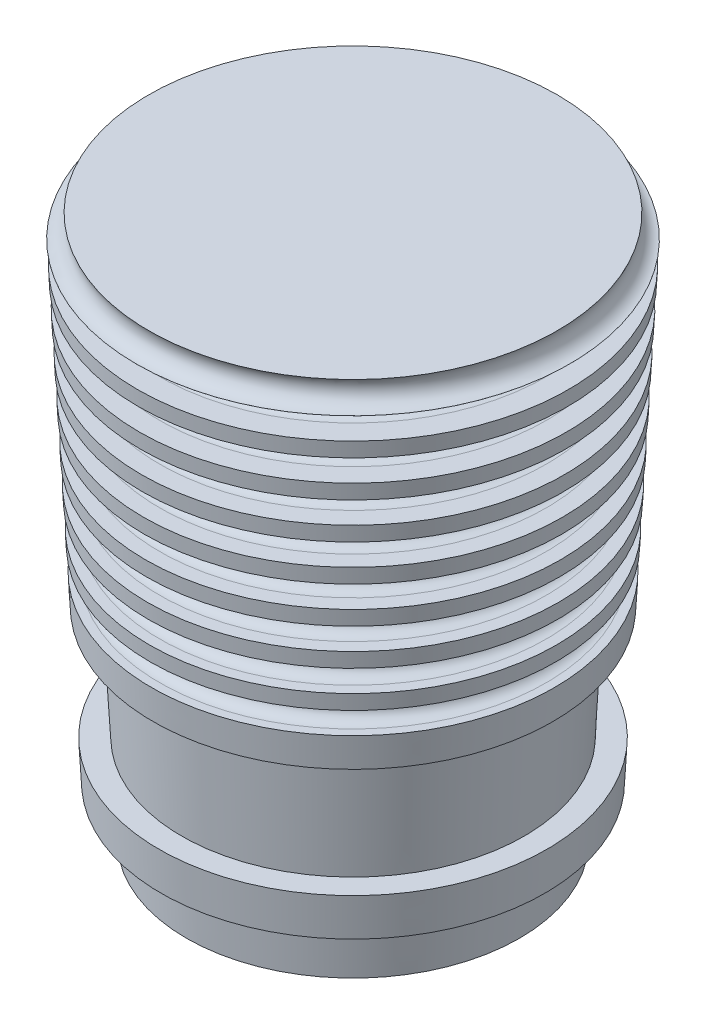
ISO-10303-21;
HEADER;
FILE_DESCRIPTION(('STEP AP214'),'2;1');
FILE_NAME('part.step','',(''),(''),'','','');
FILE_SCHEMA(('AUTOMOTIVE_DESIGN { 1 0 10303 214 1 1 1 1 }'));
ENDSEC;
DATA;
#1=APPLICATION_CONTEXT('core data for automotive mechanical design processes');
#2=APPLICATION_PROTOCOL_DEFINITION('international standard','automotive_design',2000,#1);
#3=PRODUCT_CONTEXT('',#1,'mechanical');
#4=PRODUCT('Part','Part','',(#3));
#5=PRODUCT_RELATED_PRODUCT_CATEGORY('part','',(#4));
#6=PRODUCT_DEFINITION_FORMATION('','',#4);
#7=PRODUCT_DEFINITION_CONTEXT('part definition',#1,'design');
#8=PRODUCT_DEFINITION('design','',#6,#7);
#9=PRODUCT_DEFINITION_SHAPE('','',#8);
#10=(LENGTH_UNIT() NAMED_UNIT(*) SI_UNIT(.MILLI.,.METRE.));
#11=(NAMED_UNIT(*) PLANE_ANGLE_UNIT() SI_UNIT($,.RADIAN.));
#12=(NAMED_UNIT(*) SI_UNIT($,.STERADIAN.) SOLID_ANGLE_UNIT());
#13=UNCERTAINTY_MEASURE_WITH_UNIT(LENGTH_MEASURE(1.E-05),#10,'distance_accuracy_value','');
#14=(GEOMETRIC_REPRESENTATION_CONTEXT(3) GLOBAL_UNCERTAINTY_ASSIGNED_CONTEXT((#13)) GLOBAL_UNIT_ASSIGNED_CONTEXT((#10,
#11,#12)) REPRESENTATION_CONTEXT('',''));
#15=CARTESIAN_POINT('',(0.,0.,0.));
#16=DIRECTION('',(0.,0.,1.));
#17=DIRECTION('',(1.,0.,0.));
#18=AXIS2_PLACEMENT_3D('',#15,#16,#17);
#19=CARTESIAN_POINT('',(0.,0.,0.));
#20=DIRECTION('',(0.,1.,0.));
#21=DIRECTION('',(0.,0.,1.));
#22=AXIS2_PLACEMENT_3D('',#19,#20,#21);
#23=CONICAL_SURFACE('',#22,25.,0.05235987755983);
#24=CARTESIAN_POINT('',(0.,59.,0.));
#25=DIRECTION('',(0.,1.,0.));
#26=DIRECTION('',(0.,0.,1.));
#27=AXIS2_PLACEMENT_3D('',#24,#25,#26);
#28=CIRCLE('',#27,28.0920589776994);
#29=CARTESIAN_POINT('',(0.,59.,28.0920589776994));
#30=VERTEX_POINT('',#29);
#31=EDGE_CURVE('E89',#30,#30,#28,.T.);
#32=ORIENTED_EDGE('',*,*,#31,.T.);
#33=EDGE_LOOP('',(#32));
#34=FACE_BOUND('',#33,.T.);
#35=CARTESIAN_POINT('',(0.,61.,0.));
#36=DIRECTION('',(0.,-1.,0.));
#37=DIRECTION('',(0.,0.,-1.));
#38=AXIS2_PLACEMENT_3D('',#35,#36,#37);
#39=CIRCLE('',#38,28.1968745362655);
#40=CARTESIAN_POINT('',(0.,61.,-28.1968745362655));
#41=VERTEX_POINT('',#40);
#42=EDGE_CURVE('E83',#41,#41,#39,.T.);
#43=ORIENTED_EDGE('',*,*,#42,.T.);
#44=EDGE_LOOP('',(#43));
#45=FACE_BOUND('',#44,.T.);
#46=ADVANCED_FACE('F43',(#34,#45),#23,.T.);
#47=CARTESIAN_POINT('',(0.,61.,-28.4589134326807));
#48=DIRECTION('',(0.,-1.,0.));
#49=DIRECTION('',(0.,0.,-1.));
#50=AXIS2_PLACEMENT_3D('',#47,#48,#49);
#51=PLANE('',#50);
#52=CARTESIAN_POINT('',(0.,61.,0.));
#53=DIRECTION('',(0.,-1.,0.));
#54=DIRECTION('',(0.,0.,-1.));
#55=AXIS2_PLACEMENT_3D('',#52,#53,#54);
#56=CIRCLE('',#55,25.5334080636115);
#57=CARTESIAN_POINT('',(0.,61.,-25.5334080636115));
#58=VERTEX_POINT('',#57);
#59=EDGE_CURVE('E84',#58,#58,#56,.T.);
#60=ORIENTED_EDGE('',*,*,#59,.T.);
#61=EDGE_LOOP('',(#60));
#62=FACE_BOUND('',#61,.T.);
#63=ORIENTED_EDGE('',*,*,#42,.F.);
#64=EDGE_LOOP('',(#63));
#65=FACE_BOUND('',#64,.T.);
#66=ADVANCED_FACE('F250',(#62,#65),#51,.F.);
#67=CARTESIAN_POINT('',(0.,64.,-25.5334080636115));
#68=DIRECTION('',(0.,1.,0.));
#69=DIRECTION('',(0.,0.,1.));
#70=AXIS2_PLACEMENT_3D('',#67,#68,#69);
#71=PLANE('',#70);
#72=CARTESIAN_POINT('',(0.,64.,0.));
#73=DIRECTION('',(0.,-1.,0.));
#74=DIRECTION('',(0.,0.,-1.));
#75=AXIS2_PLACEMENT_3D('',#72,#73,#74);
#76=CIRCLE('',#75,25.5334080636115);
#77=CARTESIAN_POINT('',(0.,64.,-25.5334080636115));
#78=VERTEX_POINT('',#77);
#79=EDGE_CURVE('E98',#78,#78,#76,.T.);
#80=ORIENTED_EDGE('',*,*,#79,.F.);
#81=EDGE_LOOP('',(#80));
#82=FACE_BOUND('',#81,.T.);
#83=CARTESIAN_POINT('',(0.,64.,0.));
#84=DIRECTION('',(0.,1.,0.));
#85=DIRECTION('',(0.,0.,1.));
#86=AXIS2_PLACEMENT_3D('',#83,#84,#85);
#87=CIRCLE('',#86,28.3540978741147);
#88=CARTESIAN_POINT('',(0.,64.,28.3540978741147));
#89=VERTEX_POINT('',#88);
#90=EDGE_CURVE('E79',#89,#89,#87,.T.);
#91=ORIENTED_EDGE('',*,*,#90,.F.);
#92=EDGE_LOOP('',(#91));
#93=FACE_BOUND('',#92,.T.);
#94=ADVANCED_FACE('F258',(#82,#93),#71,.F.);
#95=CARTESIAN_POINT('',(0.,62.5,0.));
#96=DIRECTION('',(0.,-1.,0.));
#97=DIRECTION('',(0.,0.,-1.));
#98=AXIS2_PLACEMENT_3D('',#95,#96,#97);
#99=TOROIDAL_SURFACE('',#98,25.5334080636115,1.49999999999999);
#100=ORIENTED_EDGE('',*,*,#59,.F.);
#101=EDGE_LOOP('',(#100));
#102=FACE_BOUND('',#101,.T.);
#103=ORIENTED_EDGE('',*,*,#79,.T.);
#104=EDGE_LOOP('',(#103));
#105=FACE_BOUND('',#104,.T.);
#106=ADVANCED_FACE('F357',(#102,#105),#99,.F.);
#107=CARTESIAN_POINT('',(0.,69.0027409305053,0.));
#108=DIRECTION('',(0.,1.,0.));
#109=DIRECTION('',(0.,0.,1.));
#110=AXIS2_PLACEMENT_3D('',#107,#108,#109);
#111=CIRCLE('',#110,28.6162804166108);
#112=CARTESIAN_POINT('',(0.,69.0027409305053,28.6162804166108));
#113=VERTEX_POINT('',#112);
#114=EDGE_CURVE('E47',#113,#113,#111,.F.);
#115=ORIENTED_EDGE('',*,*,#114,.T.);
#116=EDGE_LOOP('',(#115));
#117=FACE_BOUND('',#116,.T.);
#118=CARTESIAN_POINT('',(0.,69.,0.));
#119=DIRECTION('',(0.,-1.,0.));
#120=DIRECTION('',(0.,0.,-1.));
#121=AXIS2_PLACEMENT_3D('',#118,#119,#120);
#122=CIRCLE('',#121,28.6161367705298);
#123=CARTESIAN_POINT('',(0.,69.,-28.6161367705298));
#124=VERTEX_POINT('',#123);
#125=EDGE_CURVE('E193',#124,#124,#122,.T.);
#126=ORIENTED_EDGE('',*,*,#125,.F.);
#127=EDGE_LOOP('',(#126));
#128=FACE_BOUND('',#127,.T.);
#129=ADVANCED_FACE('F213',(#117,#128),#23,.T.);
#130=CARTESIAN_POINT('',(0.,69.,-25.5334080636115));
#131=DIRECTION('',(0.,1.,0.));
#132=DIRECTION('',(0.,0.,1.));
#133=AXIS2_PLACEMENT_3D('',#130,#131,#132);
#134=PLANE('',#133);
#135=CARTESIAN_POINT('',(0.,69.,0.));
#136=DIRECTION('',(0.,-1.,0.));
#137=DIRECTION('',(0.,0.,-1.));
#138=AXIS2_PLACEMENT_3D('',#135,#136,#137);
#139=CIRCLE('',#138,25.5334080636115);
#140=CARTESIAN_POINT('',(0.,69.,-25.5334080636115));
#141=VERTEX_POINT('',#140);
#142=EDGE_CURVE('E88',#141,#141,#139,.T.);
#143=ORIENTED_EDGE('',*,*,#142,.F.);
#144=EDGE_LOOP('',(#143));
#145=FACE_BOUND('',#144,.T.);
#146=ORIENTED_EDGE('',*,*,#125,.T.);
#147=EDGE_LOOP('',(#146));
#148=FACE_BOUND('',#147,.T.);
#149=ADVANCED_FACE('F363',(#145,#148),#134,.F.);
#150=CARTESIAN_POINT('',(0.,67.5,0.));
#151=DIRECTION('',(0.,-1.,0.));
#152=DIRECTION('',(0.,0.,-1.));
#153=AXIS2_PLACEMENT_3D('',#150,#151,#152);
#154=TOROIDAL_SURFACE('',#153,25.5334080636115,1.49999999999999);
#155=CARTESIAN_POINT('',(0.,66.,0.));
#156=DIRECTION('',(0.,-1.,0.));
#157=DIRECTION('',(0.,0.,-1.));
#158=AXIS2_PLACEMENT_3D('',#155,#156,#157);
#159=CIRCLE('',#158,25.5334080636115);
#160=CARTESIAN_POINT('',(0.,66.,-25.5334080636115));
#161=VERTEX_POINT('',#160);
#162=EDGE_CURVE('E67',#161,#161,#159,.T.);
#163=ORIENTED_EDGE('',*,*,#162,.F.);
#164=EDGE_LOOP('',(#163));
#165=FACE_BOUND('',#164,.T.);
#166=ORIENTED_EDGE('',*,*,#142,.T.);
#167=EDGE_LOOP('',(#166));
#168=FACE_BOUND('',#167,.T.);
#169=ADVANCED_FACE('F365',(#165,#168),#154,.F.);
#170=CARTESIAN_POINT('',(0.,66.,-28.4589134326807));
#171=DIRECTION('',(0.,-1.,0.));
#172=DIRECTION('',(0.,0.,-1.));
#173=AXIS2_PLACEMENT_3D('',#170,#171,#172);
#174=PLANE('',#173);
#175=CARTESIAN_POINT('',(0.,66.,0.));
#176=DIRECTION('',(0.,-1.,0.));
#177=DIRECTION('',(0.,0.,-1.));
#178=AXIS2_PLACEMENT_3D('',#175,#176,#177);
#179=CIRCLE('',#178,28.4589134326807);
#180=CARTESIAN_POINT('',(0.,66.,-28.4589134326807));
#181=VERTEX_POINT('',#180);
#182=EDGE_CURVE('E197',#181,#181,#179,.T.);
#183=ORIENTED_EDGE('',*,*,#182,.F.);
#184=EDGE_LOOP('',(#183));
#185=FACE_BOUND('',#184,.T.);
#186=ORIENTED_EDGE('',*,*,#162,.T.);
#187=EDGE_LOOP('',(#186));
#188=FACE_BOUND('',#187,.T.);
#189=ADVANCED_FACE('F264',(#185,#188),#174,.F.);
#190=ORIENTED_EDGE('',*,*,#90,.T.);
#191=EDGE_LOOP('',(#190));
#192=FACE_BOUND('',#191,.T.);
#193=ORIENTED_EDGE('',*,*,#182,.T.);
#194=EDGE_LOOP('',(#193));
#195=FACE_BOUND('',#194,.T.);
#196=ADVANCED_FACE('F252',(#192,#195),#23,.T.);
#197=CARTESIAN_POINT('',(0.,56.,-28.4589134326807));
#198=DIRECTION('',(0.,-1.,0.));
#199=DIRECTION('',(0.,0.,-1.));
#200=AXIS2_PLACEMENT_3D('',#197,#198,#199);
#201=PLANE('',#200);
#202=CARTESIAN_POINT('',(0.,56.,0.));
#203=DIRECTION('',(0.,-1.,0.));
#204=DIRECTION('',(0.,0.,-1.));
#205=AXIS2_PLACEMENT_3D('',#202,#203,#204);
#206=CIRCLE('',#205,25.5334080636115);
#207=CARTESIAN_POINT('',(0.,56.,-25.5334080636115));
#208=VERTEX_POINT('',#207);
#209=EDGE_CURVE('E94',#208,#208,#206,.T.);
#210=ORIENTED_EDGE('',*,*,#209,.T.);
#211=EDGE_LOOP('',(#210));
#212=FACE_BOUND('',#211,.T.);
#213=CARTESIAN_POINT('',(0.,56.,0.));
#214=DIRECTION('',(0.,-1.,0.));
#215=DIRECTION('',(0.,0.,-1.));
#216=AXIS2_PLACEMENT_3D('',#213,#214,#215);
#217=CIRCLE('',#216,27.9348356398503);
#218=CARTESIAN_POINT('',(0.,56.,-27.9348356398503));
#219=VERTEX_POINT('',#218);
#220=EDGE_CURVE('E93',#219,#219,#217,.T.);
#221=ORIENTED_EDGE('',*,*,#220,.F.);
#222=EDGE_LOOP('',(#221));
#223=FACE_BOUND('',#222,.T.);
#224=ADVANCED_FACE('F263',(#212,#223),#201,.F.);
#225=CARTESIAN_POINT('',(0.,59.,-25.5334080636115));
#226=DIRECTION('',(0.,1.,0.));
#227=DIRECTION('',(0.,0.,1.));
#228=AXIS2_PLACEMENT_3D('',#225,#226,#227);
#229=PLANE('',#228);
#230=CARTESIAN_POINT('',(0.,59.,0.));
#231=DIRECTION('',(0.,-1.,0.));
#232=DIRECTION('',(0.,0.,-1.));
#233=AXIS2_PLACEMENT_3D('',#230,#231,#232);
#234=CIRCLE('',#233,25.5334080636115);
#235=CARTESIAN_POINT('',(0.,59.,-25.5334080636115));
#236=VERTEX_POINT('',#235);
#237=EDGE_CURVE('E108',#236,#236,#234,.T.);
#238=ORIENTED_EDGE('',*,*,#237,.F.);
#239=EDGE_LOOP('',(#238));
#240=FACE_BOUND('',#239,.T.);
#241=ORIENTED_EDGE('',*,*,#31,.F.);
#242=EDGE_LOOP('',(#241));
#243=FACE_BOUND('',#242,.T.);
#244=ADVANCED_FACE('F278',(#240,#243),#229,.F.);
#245=CARTESIAN_POINT('',(0.,57.5,0.));
#246=DIRECTION('',(0.,-1.,0.));
#247=DIRECTION('',(0.,0.,-1.));
#248=AXIS2_PLACEMENT_3D('',#245,#246,#247);
#249=TOROIDAL_SURFACE('',#248,25.5334080636115,1.49999999999999);
#250=ORIENTED_EDGE('',*,*,#209,.F.);
#251=EDGE_LOOP('',(#250));
#252=FACE_BOUND('',#251,.T.);
#253=ORIENTED_EDGE('',*,*,#237,.T.);
#254=EDGE_LOOP('',(#253));
#255=FACE_BOUND('',#254,.T.);
#256=ADVANCED_FACE('F268',(#252,#255),#249,.F.);
#257=CARTESIAN_POINT('',(0.,54.,0.));
#258=DIRECTION('',(0.,1.,0.));
#259=DIRECTION('',(0.,0.,1.));
#260=AXIS2_PLACEMENT_3D('',#257,#258,#259);
#261=CIRCLE('',#260,27.8300200812842);
#262=CARTESIAN_POINT('',(0.,54.,27.8300200812842));
#263=VERTEX_POINT('',#262);
#264=EDGE_CURVE('E99',#263,#263,#261,.T.);
#265=ORIENTED_EDGE('',*,*,#264,.T.);
#266=EDGE_LOOP('',(#265));
#267=FACE_BOUND('',#266,.T.);
#268=ORIENTED_EDGE('',*,*,#220,.T.);
#269=EDGE_LOOP('',(#268));
#270=FACE_BOUND('',#269,.T.);
#271=ADVANCED_FACE('F253',(#267,#270),#23,.T.);
#272=CARTESIAN_POINT('',(0.,51.,-28.4589134326807));
#273=DIRECTION('',(0.,-1.,0.));
#274=DIRECTION('',(0.,0.,-1.));
#275=AXIS2_PLACEMENT_3D('',#272,#273,#274);
#276=PLANE('',#275);
#277=CARTESIAN_POINT('',(0.,51.,0.));
#278=DIRECTION('',(0.,-1.,0.));
#279=DIRECTION('',(0.,0.,-1.));
#280=AXIS2_PLACEMENT_3D('',#277,#278,#279);
#281=CIRCLE('',#280,25.5334080636115);
#282=CARTESIAN_POINT('',(0.,51.,-25.5334080636115));
#283=VERTEX_POINT('',#282);
#284=EDGE_CURVE('E104',#283,#283,#281,.T.);
#285=ORIENTED_EDGE('',*,*,#284,.T.);
#286=EDGE_LOOP('',(#285));
#287=FACE_BOUND('',#286,.T.);
#288=CARTESIAN_POINT('',(0.,51.,0.));
#289=DIRECTION('',(0.,-1.,0.));
#290=DIRECTION('',(0.,0.,-1.));
#291=AXIS2_PLACEMENT_3D('',#288,#289,#290);
#292=CIRCLE('',#291,27.6727967434351);
#293=CARTESIAN_POINT('',(0.,51.,-27.6727967434351));
#294=VERTEX_POINT('',#293);
#295=EDGE_CURVE('E103',#294,#294,#292,.T.);
#296=ORIENTED_EDGE('',*,*,#295,.F.);
#297=EDGE_LOOP('',(#296));
#298=FACE_BOUND('',#297,.T.);
#299=ADVANCED_FACE('F267',(#287,#298),#276,.F.);
#300=CARTESIAN_POINT('',(0.,54.,-25.5334080636115));
#301=DIRECTION('',(0.,1.,0.));
#302=DIRECTION('',(0.,0.,1.));
#303=AXIS2_PLACEMENT_3D('',#300,#301,#302);
#304=PLANE('',#303);
#305=CARTESIAN_POINT('',(0.,54.,0.));
#306=DIRECTION('',(0.,-1.,0.));
#307=DIRECTION('',(0.,0.,-1.));
#308=AXIS2_PLACEMENT_3D('',#305,#306,#307);
#309=CIRCLE('',#308,25.5334080636115);
#310=CARTESIAN_POINT('',(0.,54.,-25.5334080636115));
#311=VERTEX_POINT('',#310);
#312=EDGE_CURVE('E118',#311,#311,#309,.T.);
#313=ORIENTED_EDGE('',*,*,#312,.F.);
#314=EDGE_LOOP('',(#313));
#315=FACE_BOUND('',#314,.T.);
#316=ORIENTED_EDGE('',*,*,#264,.F.);
#317=EDGE_LOOP('',(#316));
#318=FACE_BOUND('',#317,.T.);
#319=ADVANCED_FACE('F275',(#315,#318),#304,.F.);
#320=CARTESIAN_POINT('',(0.,52.5,0.));
#321=DIRECTION('',(0.,-1.,0.));
#322=DIRECTION('',(0.,0.,-1.));
#323=AXIS2_PLACEMENT_3D('',#320,#321,#322);
#324=TOROIDAL_SURFACE('',#323,25.5334080636115,1.49999999999999);
#325=ORIENTED_EDGE('',*,*,#284,.F.);
#326=EDGE_LOOP('',(#325));
#327=FACE_BOUND('',#326,.T.);
#328=ORIENTED_EDGE('',*,*,#312,.T.);
#329=EDGE_LOOP('',(#328));
#330=FACE_BOUND('',#329,.T.);
#331=ADVANCED_FACE('F284',(#327,#330),#324,.F.);
#332=CARTESIAN_POINT('',(0.,49.,0.));
#333=DIRECTION('',(0.,1.,0.));
#334=DIRECTION('',(0.,0.,1.));
#335=AXIS2_PLACEMENT_3D('',#332,#333,#334);
#336=CIRCLE('',#335,27.567981184869);
#337=CARTESIAN_POINT('',(0.,49.,27.567981184869));
#338=VERTEX_POINT('',#337);
#339=EDGE_CURVE('E109',#338,#338,#336,.T.);
#340=ORIENTED_EDGE('',*,*,#339,.T.);
#341=EDGE_LOOP('',(#340));
#342=FACE_BOUND('',#341,.T.);
#343=ORIENTED_EDGE('',*,*,#295,.T.);
#344=EDGE_LOOP('',(#343));
#345=FACE_BOUND('',#344,.T.);
#346=ADVANCED_FACE('F270',(#342,#345),#23,.T.);
#347=CARTESIAN_POINT('',(0.,46.,-28.4589134326807));
#348=DIRECTION('',(0.,-1.,0.));
#349=DIRECTION('',(0.,0.,-1.));
#350=AXIS2_PLACEMENT_3D('',#347,#348,#349);
#351=PLANE('',#350);
#352=CARTESIAN_POINT('',(0.,46.,0.));
#353=DIRECTION('',(0.,-1.,0.));
#354=DIRECTION('',(0.,0.,-1.));
#355=AXIS2_PLACEMENT_3D('',#352,#353,#354);
#356=CIRCLE('',#355,25.5334080636115);
#357=CARTESIAN_POINT('',(0.,46.,-25.5334080636115));
#358=VERTEX_POINT('',#357);
#359=EDGE_CURVE('E114',#358,#358,#356,.T.);
#360=ORIENTED_EDGE('',*,*,#359,.T.);
#361=EDGE_LOOP('',(#360));
#362=FACE_BOUND('',#361,.T.);
#363=CARTESIAN_POINT('',(0.,46.,0.));
#364=DIRECTION('',(0.,-1.,0.));
#365=DIRECTION('',(0.,0.,-1.));
#366=AXIS2_PLACEMENT_3D('',#363,#364,#365);
#367=CIRCLE('',#366,27.4107578470199);
#368=CARTESIAN_POINT('',(0.,46.,-27.4107578470199));
#369=VERTEX_POINT('',#368);
#370=EDGE_CURVE('E113',#369,#369,#367,.T.);
#371=ORIENTED_EDGE('',*,*,#370,.F.);
#372=EDGE_LOOP('',(#371));
#373=FACE_BOUND('',#372,.T.);
#374=ADVANCED_FACE('F283',(#362,#373),#351,.F.);
#375=CARTESIAN_POINT('',(0.,49.,-25.5334080636115));
#376=DIRECTION('',(0.,1.,0.));
#377=DIRECTION('',(0.,0.,1.));
#378=AXIS2_PLACEMENT_3D('',#375,#376,#377);
#379=PLANE('',#378);
#380=CARTESIAN_POINT('',(0.,49.,0.));
#381=DIRECTION('',(0.,-1.,0.));
#382=DIRECTION('',(0.,0.,-1.));
#383=AXIS2_PLACEMENT_3D('',#380,#381,#382);
#384=CIRCLE('',#383,25.5334080636115);
#385=CARTESIAN_POINT('',(0.,49.,-25.5334080636115));
#386=VERTEX_POINT('',#385);
#387=EDGE_CURVE('E128',#386,#386,#384,.T.);
#388=ORIENTED_EDGE('',*,*,#387,.F.);
#389=EDGE_LOOP('',(#388));
#390=FACE_BOUND('',#389,.T.);
#391=ORIENTED_EDGE('',*,*,#339,.F.);
#392=EDGE_LOOP('',(#391));
#393=FACE_BOUND('',#392,.T.);
#394=ADVANCED_FACE('F291',(#390,#393),#379,.F.);
#395=CARTESIAN_POINT('',(0.,47.5,0.));
#396=DIRECTION('',(0.,-1.,0.));
#397=DIRECTION('',(0.,0.,-1.));
#398=AXIS2_PLACEMENT_3D('',#395,#396,#397);
#399=TOROIDAL_SURFACE('',#398,25.5334080636115,1.49999999999999);
#400=ORIENTED_EDGE('',*,*,#359,.F.);
#401=EDGE_LOOP('',(#400));
#402=FACE_BOUND('',#401,.T.);
#403=ORIENTED_EDGE('',*,*,#387,.T.);
#404=EDGE_LOOP('',(#403));
#405=FACE_BOUND('',#404,.T.);
#406=ADVANCED_FACE('F299',(#402,#405),#399,.F.);
#407=CARTESIAN_POINT('',(0.,44.,0.));
#408=DIRECTION('',(0.,1.,0.));
#409=DIRECTION('',(0.,0.,1.));
#410=AXIS2_PLACEMENT_3D('',#407,#408,#409);
#411=CIRCLE('',#410,27.3059422884538);
#412=CARTESIAN_POINT('',(0.,44.,27.3059422884538));
#413=VERTEX_POINT('',#412);
#414=EDGE_CURVE('E119',#413,#413,#411,.T.);
#415=ORIENTED_EDGE('',*,*,#414,.T.);
#416=EDGE_LOOP('',(#415));
#417=FACE_BOUND('',#416,.T.);
#418=ORIENTED_EDGE('',*,*,#370,.T.);
#419=EDGE_LOOP('',(#418));
#420=FACE_BOUND('',#419,.T.);
#421=ADVANCED_FACE('F286',(#417,#420),#23,.T.);
#422=CARTESIAN_POINT('',(0.,41.,-28.4589134326807));
#423=DIRECTION('',(0.,-1.,0.));
#424=DIRECTION('',(0.,0.,-1.));
#425=AXIS2_PLACEMENT_3D('',#422,#423,#424);
#426=PLANE('',#425);
#427=CARTESIAN_POINT('',(0.,41.,0.));
#428=DIRECTION('',(0.,-1.,0.));
#429=DIRECTION('',(0.,0.,-1.));
#430=AXIS2_PLACEMENT_3D('',#427,#428,#429);
#431=CIRCLE('',#430,25.5334080636115);
#432=CARTESIAN_POINT('',(0.,41.,-25.5334080636115));
#433=VERTEX_POINT('',#432);
#434=EDGE_CURVE('E124',#433,#433,#431,.T.);
#435=ORIENTED_EDGE('',*,*,#434,.T.);
#436=EDGE_LOOP('',(#435));
#437=FACE_BOUND('',#436,.T.);
#438=CARTESIAN_POINT('',(0.,41.,0.));
#439=DIRECTION('',(0.,-1.,0.));
#440=DIRECTION('',(0.,0.,-1.));
#441=AXIS2_PLACEMENT_3D('',#438,#439,#440);
#442=CIRCLE('',#441,27.1487189506047);
#443=CARTESIAN_POINT('',(0.,41.,-27.1487189506047));
#444=VERTEX_POINT('',#443);
#445=EDGE_CURVE('E123',#444,#444,#442,.T.);
#446=ORIENTED_EDGE('',*,*,#445,.F.);
#447=EDGE_LOOP('',(#446));
#448=FACE_BOUND('',#447,.T.);
#449=ADVANCED_FACE('F298',(#437,#448),#426,.F.);
#450=CARTESIAN_POINT('',(0.,44.,-25.5334080636115));
#451=DIRECTION('',(0.,1.,0.));
#452=DIRECTION('',(0.,0.,1.));
#453=AXIS2_PLACEMENT_3D('',#450,#451,#452);
#454=PLANE('',#453);
#455=CARTESIAN_POINT('',(0.,44.,0.));
#456=DIRECTION('',(0.,-1.,0.));
#457=DIRECTION('',(0.,0.,-1.));
#458=AXIS2_PLACEMENT_3D('',#455,#456,#457);
#459=CIRCLE('',#458,25.5334080636115);
#460=CARTESIAN_POINT('',(0.,44.,-25.5334080636115));
#461=VERTEX_POINT('',#460);
#462=EDGE_CURVE('E138',#461,#461,#459,.T.);
#463=ORIENTED_EDGE('',*,*,#462,.F.);
#464=EDGE_LOOP('',(#463));
#465=FACE_BOUND('',#464,.T.);
#466=ORIENTED_EDGE('',*,*,#414,.F.);
#467=EDGE_LOOP('',(#466));
#468=FACE_BOUND('',#467,.T.);
#469=ADVANCED_FACE('F305',(#465,#468),#454,.F.);
#470=CARTESIAN_POINT('',(0.,42.5,0.));
#471=DIRECTION('',(0.,-1.,0.));
#472=DIRECTION('',(0.,0.,-1.));
#473=AXIS2_PLACEMENT_3D('',#470,#471,#472);
#474=TOROIDAL_SURFACE('',#473,25.5334080636115,1.49999999999999);
#475=ORIENTED_EDGE('',*,*,#434,.F.);
#476=EDGE_LOOP('',(#475));
#477=FACE_BOUND('',#476,.T.);
#478=ORIENTED_EDGE('',*,*,#462,.T.);
#479=EDGE_LOOP('',(#478));
#480=FACE_BOUND('',#479,.T.);
#481=ADVANCED_FACE('F313',(#477,#480),#474,.F.);
#482=CARTESIAN_POINT('',(0.,39.,0.));
#483=DIRECTION('',(0.,1.,0.));
#484=DIRECTION('',(0.,0.,1.));
#485=AXIS2_PLACEMENT_3D('',#482,#483,#484);
#486=CIRCLE('',#485,27.0439033920386);
#487=CARTESIAN_POINT('',(0.,39.,27.0439033920386));
#488=VERTEX_POINT('',#487);
#489=EDGE_CURVE('E129',#488,#488,#486,.T.);
#490=ORIENTED_EDGE('',*,*,#489,.T.);
#491=EDGE_LOOP('',(#490));
#492=FACE_BOUND('',#491,.T.);
#493=ORIENTED_EDGE('',*,*,#445,.T.);
#494=EDGE_LOOP('',(#493));
#495=FACE_BOUND('',#494,.T.);
#496=ADVANCED_FACE('F248',(#492,#495),#23,.T.);
#497=CARTESIAN_POINT('',(0.,36.,-28.4589134326807));
#498=DIRECTION('',(0.,-1.,0.));
#499=DIRECTION('',(0.,0.,-1.));
#500=AXIS2_PLACEMENT_3D('',#497,#498,#499);
#501=PLANE('',#500);
#502=CARTESIAN_POINT('',(0.,36.,0.));
#503=DIRECTION('',(0.,-1.,0.));
#504=DIRECTION('',(0.,0.,-1.));
#505=AXIS2_PLACEMENT_3D('',#502,#503,#504);
#506=CIRCLE('',#505,25.5334080636115);
#507=CARTESIAN_POINT('',(0.,36.,-25.5334080636115));
#508=VERTEX_POINT('',#507);
#509=EDGE_CURVE('E134',#508,#508,#506,.T.);
#510=ORIENTED_EDGE('',*,*,#509,.T.);
#511=EDGE_LOOP('',(#510));
#512=FACE_BOUND('',#511,.T.);
#513=CARTESIAN_POINT('',(0.,36.,0.));
#514=DIRECTION('',(0.,-1.,0.));
#515=DIRECTION('',(0.,0.,-1.));
#516=AXIS2_PLACEMENT_3D('',#513,#514,#515);
#517=CIRCLE('',#516,26.8866800541895);
#518=CARTESIAN_POINT('',(0.,36.,-26.8866800541895));
#519=VERTEX_POINT('',#518);
#520=EDGE_CURVE('E133',#519,#519,#517,.T.);
#521=ORIENTED_EDGE('',*,*,#520,.F.);
#522=EDGE_LOOP('',(#521));
#523=FACE_BOUND('',#522,.T.);
#524=ADVANCED_FACE('F312',(#512,#523),#501,.F.);
#525=CARTESIAN_POINT('',(0.,39.,-25.5334080636115));
#526=DIRECTION('',(0.,1.,0.));
#527=DIRECTION('',(0.,0.,1.));
#528=AXIS2_PLACEMENT_3D('',#525,#526,#527);
#529=PLANE('',#528);
#530=CARTESIAN_POINT('',(0.,39.,0.));
#531=DIRECTION('',(0.,-1.,0.));
#532=DIRECTION('',(0.,0.,-1.));
#533=AXIS2_PLACEMENT_3D('',#530,#531,#532);
#534=CIRCLE('',#533,25.5334080636115);
#535=CARTESIAN_POINT('',(0.,39.,-25.5334080636115));
#536=VERTEX_POINT('',#535);
#537=EDGE_CURVE('E146',#536,#536,#534,.T.);
#538=ORIENTED_EDGE('',*,*,#537,.F.);
#539=EDGE_LOOP('',(#538));
#540=FACE_BOUND('',#539,.T.);
#541=ORIENTED_EDGE('',*,*,#489,.F.);
#542=EDGE_LOOP('',(#541));
#543=FACE_BOUND('',#542,.T.);
#544=ADVANCED_FACE('F319',(#540,#543),#529,.F.);
#545=CARTESIAN_POINT('',(0.,37.5,0.));
#546=DIRECTION('',(0.,-1.,0.));
#547=DIRECTION('',(0.,0.,-1.));
#548=AXIS2_PLACEMENT_3D('',#545,#546,#547);
#549=TOROIDAL_SURFACE('',#548,25.5334080636115,1.49999999999999);
#550=ORIENTED_EDGE('',*,*,#509,.F.);
#551=EDGE_LOOP('',(#550));
#552=FACE_BOUND('',#551,.T.);
#553=ORIENTED_EDGE('',*,*,#537,.T.);
#554=EDGE_LOOP('',(#553));
#555=FACE_BOUND('',#554,.T.);
#556=ADVANCED_FACE('F246',(#552,#555),#549,.F.);
#557=CARTESIAN_POINT('',(0.,34.,0.));
#558=DIRECTION('',(0.,1.,0.));
#559=DIRECTION('',(0.,0.,1.));
#560=AXIS2_PLACEMENT_3D('',#557,#558,#559);
#561=CIRCLE('',#560,26.7818644956234);
#562=CARTESIAN_POINT('',(0.,34.,26.7818644956234));
#563=VERTEX_POINT('',#562);
#564=EDGE_CURVE('E139',#563,#563,#561,.T.);
#565=ORIENTED_EDGE('',*,*,#564,.T.);
#566=EDGE_LOOP('',(#565));
#567=FACE_BOUND('',#566,.T.);
#568=ORIENTED_EDGE('',*,*,#520,.T.);
#569=EDGE_LOOP('',(#568));
#570=FACE_BOUND('',#569,.T.);
#571=ADVANCED_FACE('F235',(#567,#570),#23,.T.);
#572=CARTESIAN_POINT('',(0.,31.,-28.4589134326807));
#573=DIRECTION('',(0.,-1.,0.));
#574=DIRECTION('',(0.,0.,-1.));
#575=AXIS2_PLACEMENT_3D('',#572,#573,#574);
#576=PLANE('',#575);
#577=CARTESIAN_POINT('',(0.,31.,0.));
#578=DIRECTION('',(0.,-1.,0.));
#579=DIRECTION('',(0.,0.,-1.));
#580=AXIS2_PLACEMENT_3D('',#577,#578,#579);
#581=CIRCLE('',#580,25.5334080636115);
#582=CARTESIAN_POINT('',(0.,31.,-25.5334080636115));
#583=VERTEX_POINT('',#582);
#584=EDGE_CURVE('E143',#583,#583,#581,.T.);
#585=ORIENTED_EDGE('',*,*,#584,.T.);
#586=EDGE_LOOP('',(#585));
#587=FACE_BOUND('',#586,.T.);
#588=CARTESIAN_POINT('',(0.,31.,0.));
#589=DIRECTION('',(0.,-1.,0.));
#590=DIRECTION('',(0.,0.,-1.));
#591=AXIS2_PLACEMENT_3D('',#588,#589,#590);
#592=CIRCLE('',#591,26.6246411577743);
#593=CARTESIAN_POINT('',(0.,31.,-26.6246411577743));
#594=VERTEX_POINT('',#593);
#595=EDGE_CURVE('E142',#594,#594,#592,.T.);
#596=ORIENTED_EDGE('',*,*,#595,.F.);
#597=EDGE_LOOP('',(#596));
#598=FACE_BOUND('',#597,.T.);
#599=ADVANCED_FACE('F245',(#587,#598),#576,.F.);
#600=CARTESIAN_POINT('',(0.,34.,-25.5334080636115));
#601=DIRECTION('',(0.,1.,0.));
#602=DIRECTION('',(0.,0.,1.));
#603=AXIS2_PLACEMENT_3D('',#600,#601,#602);
#604=PLANE('',#603);
#605=CARTESIAN_POINT('',(0.,34.,0.));
#606=DIRECTION('',(0.,-1.,0.));
#607=DIRECTION('',(0.,0.,-1.));
#608=AXIS2_PLACEMENT_3D('',#605,#606,#607);
#609=CIRCLE('',#608,25.5334080636115);
#610=CARTESIAN_POINT('',(0.,34.,-25.5334080636115));
#611=VERTEX_POINT('',#610);
#612=EDGE_CURVE('E400',#611,#611,#609,.T.);
#613=ORIENTED_EDGE('',*,*,#612,.F.);
#614=EDGE_LOOP('',(#613));
#615=FACE_BOUND('',#614,.T.);
#616=ORIENTED_EDGE('',*,*,#564,.F.);
#617=EDGE_LOOP('',(#616));
#618=FACE_BOUND('',#617,.T.);
#619=ADVANCED_FACE('F387',(#615,#618),#604,.F.);
#620=CARTESIAN_POINT('',(0.,32.5,0.));
#621=DIRECTION('',(0.,-1.,0.));
#622=DIRECTION('',(0.,0.,-1.));
#623=AXIS2_PLACEMENT_3D('',#620,#621,#622);
#624=TOROIDAL_SURFACE('',#623,25.5334080636115,1.49999999999999);
#625=ORIENTED_EDGE('',*,*,#584,.F.);
#626=EDGE_LOOP('',(#625));
#627=FACE_BOUND('',#626,.T.);
#628=ORIENTED_EDGE('',*,*,#612,.T.);
#629=EDGE_LOOP('',(#628));
#630=FACE_BOUND('',#629,.T.);
#631=ADVANCED_FACE('F338',(#627,#630),#624,.F.);
#632=CARTESIAN_POINT('',(0.,0.,0.));
#633=DIRECTION('',(0.,1.,0.));
#634=DIRECTION('',(0.,0.,1.));
#635=AXIS2_PLACEMENT_3D('',#632,#633,#634);
#636=PLANE('',#635);
#637=CARTESIAN_POINT('',(0.,0.,0.));
#638=DIRECTION('',(0.,-1.,0.));
#639=DIRECTION('',(0.,0.,-1.));
#640=AXIS2_PLACEMENT_3D('',#637,#638,#639);
#641=CIRCLE('',#640,22.);
#642=CARTESIAN_POINT('',(0.,0.,-22.));
#643=VERTEX_POINT('',#642);
#644=EDGE_CURVE('E52',#643,#643,#641,.T.);
#645=ORIENTED_EDGE('',*,*,#644,.T.);
#646=EDGE_LOOP('',(#645));
#647=FACE_BOUND('',#646,.T.);
#648=ADVANCED_FACE('F376',(#647),#636,.F.);
#649=CARTESIAN_POINT('',(0.,6.99040674328202,0.));
#650=DIRECTION('',(0.,1.,0.));
#651=DIRECTION('',(0.,0.,1.));
#652=AXIS2_PLACEMENT_3D('',#649,#650,#651);
#653=CONICAL_SURFACE('',#652,22.3663516937006,0.0523598775598296);
#654=ORIENTED_EDGE('',*,*,#644,.F.);
#655=EDGE_LOOP('',(#654));
#656=FACE_BOUND('',#655,.T.);
#657=CARTESIAN_POINT('',(0.,6.99040674328202,0.));
#658=DIRECTION('',(0.,-1.,0.));
#659=DIRECTION('',(0.,0.,-1.));
#660=AXIS2_PLACEMENT_3D('',#657,#658,#659);
#661=CIRCLE('',#660,22.3663516937006);
#662=CARTESIAN_POINT('',(0.,6.99040674328202,-22.3663516937006));
#663=VERTEX_POINT('',#662);
#664=EDGE_CURVE('E10',#663,#663,#661,.T.);
#665=ORIENTED_EDGE('',*,*,#664,.T.);
#666=EDGE_LOOP('',(#665));
#667=FACE_BOUND('',#666,.T.);
#668=ADVANCED_FACE('F373',(#656,#667),#653,.T.);
#669=CARTESIAN_POINT('',(0.,6.83361404838054,0.));
#670=DIRECTION('',(0.,-1.,0.));
#671=DIRECTION('',(0.,0.,-1.));
#672=AXIS2_PLACEMENT_3D('',#669,#670,#671);
#673=CONICAL_SURFACE('',#672,25.358134536753,1.51843644923507);
#674=ORIENTED_EDGE('',*,*,#664,.F.);
#675=EDGE_LOOP('',(#674));
#676=FACE_BOUND('',#675,.T.);
#677=CARTESIAN_POINT('',(0.,6.83361404838054,0.));
#678=DIRECTION('',(0.,-1.,0.));
#679=DIRECTION('',(0.,0.,-1.));
#680=AXIS2_PLACEMENT_3D('',#677,#678,#679);
#681=CIRCLE('',#680,25.358134536753);
#682=CARTESIAN_POINT('',(0.,6.83361404838054,-25.358134536753));
#683=VERTEX_POINT('',#682);
#684=EDGE_CURVE('E58',#683,#683,#681,.T.);
#685=ORIENTED_EDGE('',*,*,#684,.T.);
#686=EDGE_LOOP('',(#685));
#687=FACE_BOUND('',#686,.T.);
#688=ADVANCED_FACE('F207',(#676,#687),#673,.F.);
#689=ORIENTED_EDGE('',*,*,#684,.F.);
#690=EDGE_LOOP('',(#689));
#691=FACE_BOUND('',#690,.T.);
#692=CARTESIAN_POINT('',(0.,12.,0.));
#693=DIRECTION('',(0.,-1.,0.));
#694=DIRECTION('',(0.,0.,-1.));
#695=AXIS2_PLACEMENT_3D('',#692,#693,#694);
#696=CIRCLE('',#695,25.6288933513965);
#697=CARTESIAN_POINT('',(0.,12.,-25.6288933513965));
#698=VERTEX_POINT('',#697);
#699=EDGE_CURVE('E66',#698,#698,#696,.T.);
#700=ORIENTED_EDGE('',*,*,#699,.T.);
#701=EDGE_LOOP('',(#700));
#702=FACE_BOUND('',#701,.T.);
#703=ADVANCED_FACE('F45',(#691,#702),#23,.T.);
#704=CARTESIAN_POINT('',(22.6288933513965,12.,0.));
#705=DIRECTION('',(0.,-1.,0.));
#706=DIRECTION('',(0.,0.,-1.));
#707=AXIS2_PLACEMENT_3D('',#704,#705,#706);
#708=PLANE('',#707);
#709=ORIENTED_EDGE('',*,*,#699,.F.);
#710=EDGE_LOOP('',(#709));
#711=FACE_BOUND('',#710,.T.);
#712=CARTESIAN_POINT('',(0.,12.,0.));
#713=DIRECTION('',(0.,-1.,0.));
#714=DIRECTION('',(0.,0.,-1.));
#715=AXIS2_PLACEMENT_3D('',#712,#713,#714);
#716=CIRCLE('',#715,22.6288933513965);
#717=CARTESIAN_POINT('',(0.,12.,-22.6288933513965));
#718=VERTEX_POINT('',#717);
#719=EDGE_CURVE('E71',#718,#718,#716,.T.);
#720=ORIENTED_EDGE('',*,*,#719,.T.);
#721=EDGE_LOOP('',(#720));
#722=FACE_BOUND('',#721,.T.);
#723=ADVANCED_FACE('F211',(#711,#722),#708,.F.);
#724=CARTESIAN_POINT('',(0.,27.,0.));
#725=DIRECTION('',(0.,1.,0.));
#726=DIRECTION('',(0.,0.,1.));
#727=AXIS2_PLACEMENT_3D('',#724,#725,#726);
#728=CONICAL_SURFACE('',#727,23.4150100406421,0.0523598775598297);
#729=ORIENTED_EDGE('',*,*,#719,.F.);
#730=EDGE_LOOP('',(#729));
#731=FACE_BOUND('',#730,.T.);
#732=CARTESIAN_POINT('',(0.,27.,0.));
#733=DIRECTION('',(0.,-1.,0.));
#734=DIRECTION('',(0.,0.,-1.));
#735=AXIS2_PLACEMENT_3D('',#732,#733,#734);
#736=CIRCLE('',#735,23.4150100406421);
#737=CARTESIAN_POINT('',(0.,27.,-23.4150100406421));
#738=VERTEX_POINT('',#737);
#739=EDGE_CURVE('E75',#738,#738,#736,.T.);
#740=ORIENTED_EDGE('',*,*,#739,.T.);
#741=EDGE_LOOP('',(#740));
#742=FACE_BOUND('',#741,.T.);
#743=ADVANCED_FACE('F218',(#731,#742),#728,.T.);
#744=CARTESIAN_POINT('',(26.4150100406421,27.,0.));
#745=DIRECTION('',(0.,1.,0.));
#746=DIRECTION('',(0.,0.,1.));
#747=AXIS2_PLACEMENT_3D('',#744,#745,#746);
#748=PLANE('',#747);
#749=ORIENTED_EDGE('',*,*,#739,.F.);
#750=EDGE_LOOP('',(#749));
#751=FACE_BOUND('',#750,.T.);
#752=CARTESIAN_POINT('',(0.,27.,0.));
#753=DIRECTION('',(0.,-1.,0.));
#754=DIRECTION('',(0.,0.,-1.));
#755=AXIS2_PLACEMENT_3D('',#752,#753,#754);
#756=CIRCLE('',#755,26.4150100406421);
#757=CARTESIAN_POINT('',(0.,27.,-26.4150100406421));
#758=VERTEX_POINT('',#757);
#759=EDGE_CURVE('E62',#758,#758,#756,.T.);
#760=ORIENTED_EDGE('',*,*,#759,.T.);
#761=EDGE_LOOP('',(#760));
#762=FACE_BOUND('',#761,.T.);
#763=ADVANCED_FACE('F224',(#751,#762),#748,.F.);
#764=ORIENTED_EDGE('',*,*,#595,.T.);
#765=EDGE_LOOP('',(#764));
#766=FACE_BOUND('',#765,.T.);
#767=ORIENTED_EDGE('',*,*,#759,.F.);
#768=EDGE_LOOP('',(#767));
#769=FACE_BOUND('',#768,.T.);
#770=ADVANCED_FACE('F212',(#766,#769),#23,.T.);
#771=CARTESIAN_POINT('',(0.,71.,0.));
#772=DIRECTION('',(0.,-1.,0.));
#773=DIRECTION('',(0.,0.,-1.));
#774=AXIS2_PLACEMENT_3D('',#771,#772,#773);
#775=TOROIDAL_SURFACE('',#774,28.7209523290959,2.00000000000001);
#776=CARTESIAN_POINT('',(0.,72.,0.));
#777=DIRECTION('',(0.,-1.,0.));
#778=DIRECTION('',(0.,0.,-1.));
#779=AXIS2_PLACEMENT_3D('',#776,#777,#778);
#780=CIRCLE('',#779,26.9889015215271);
#781=CARTESIAN_POINT('',(0.,72.,-26.9889015215271));
#782=VERTEX_POINT('',#781);
#783=EDGE_CURVE('E402',#782,#782,#780,.T.);
#784=ORIENTED_EDGE('',*,*,#783,.T.);
#785=EDGE_LOOP('',(#784));
#786=FACE_BOUND('',#785,.T.);
#787=ORIENTED_EDGE('',*,*,#114,.F.);
#788=EDGE_LOOP('',(#787));
#789=FACE_BOUND('',#788,.T.);
#790=ADVANCED_FACE('F234',(#786,#789),#775,.F.);
#791=CARTESIAN_POINT('',(0.,72.,0.));
#792=DIRECTION('',(0.,1.,0.));
#793=DIRECTION('',(0.,0.,1.));
#794=AXIS2_PLACEMENT_3D('',#791,#792,#793);
#795=PLANE('',#794);
#796=ORIENTED_EDGE('',*,*,#783,.F.);
#797=EDGE_LOOP('',(#796));
#798=FACE_BOUND('',#797,.T.);
#799=ADVANCED_FACE('F241',(#798),#795,.T.);
#800=CLOSED_SHELL('',(#46,#66,#94,#106,#129,#149,#169,#189,#196,#224,#244,#256,#271,#299,#319,
#331,#346,#374,#394,#406,#421,#449,#469,#481,#496,#524,#544,#556,#571,#599,#619,#631,#648,#668,
#688,#703,#723,#743,#763,#770,#790,#799));
#801=MANIFOLD_SOLID_BREP('B2',#800);
#802=ADVANCED_BREP_SHAPE_REPRESENTATION('',(#18,#801),#14);
#803=SHAPE_DEFINITION_REPRESENTATION(#9,#802);
ENDSEC;
END-ISO-10303-21;
